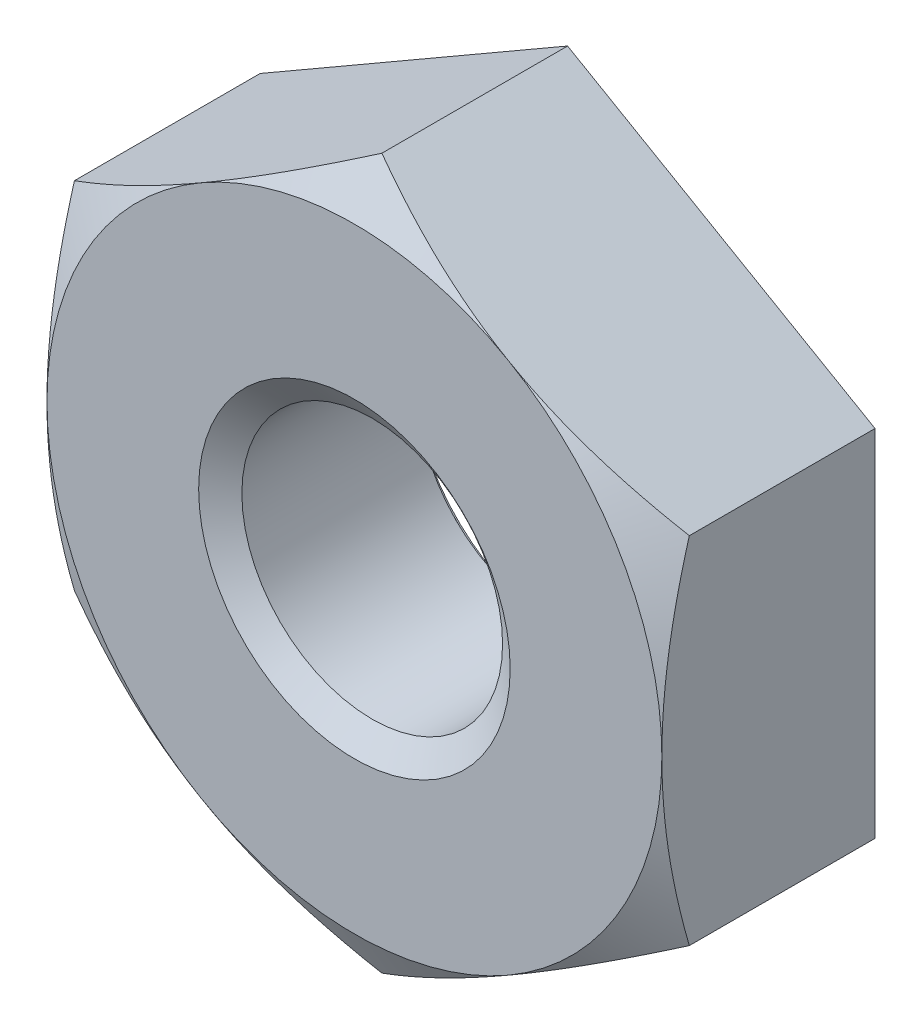
ISO-10303-21;
HEADER;
FILE_DESCRIPTION(('STEP AP214'),'2;1');
FILE_NAME('part.step','',(''),(''),'','','');
FILE_SCHEMA(('AUTOMOTIVE_DESIGN { 1 0 10303 214 1 1 1 1 }'));
ENDSEC;
DATA;
#1=APPLICATION_CONTEXT('core data for automotive mechanical design processes');
#2=APPLICATION_PROTOCOL_DEFINITION('international standard','automotive_design',2000,#1);
#3=PRODUCT_CONTEXT('',#1,'mechanical');
#4=PRODUCT('Part','Part','',(#3));
#5=PRODUCT_RELATED_PRODUCT_CATEGORY('part','',(#4));
#6=PRODUCT_DEFINITION_FORMATION('','',#4);
#7=PRODUCT_DEFINITION_CONTEXT('part definition',#1,'design');
#8=PRODUCT_DEFINITION('design','',#6,#7);
#9=PRODUCT_DEFINITION_SHAPE('','',#8);
#10=(LENGTH_UNIT() NAMED_UNIT(*) SI_UNIT(.MILLI.,.METRE.));
#11=(NAMED_UNIT(*) PLANE_ANGLE_UNIT() SI_UNIT($,.RADIAN.));
#12=(NAMED_UNIT(*) SI_UNIT($,.STERADIAN.) SOLID_ANGLE_UNIT());
#13=UNCERTAINTY_MEASURE_WITH_UNIT(LENGTH_MEASURE(1.E-05),#10,'distance_accuracy_value','');
#14=(GEOMETRIC_REPRESENTATION_CONTEXT(3) GLOBAL_UNCERTAINTY_ASSIGNED_CONTEXT((#13)) GLOBAL_UNIT_ASSIGNED_CONTEXT((#10,
#11,#12)) REPRESENTATION_CONTEXT('',''));
#15=CARTESIAN_POINT('',(0.,0.,0.));
#16=DIRECTION('',(0.,0.,1.));
#17=DIRECTION('',(1.,0.,0.));
#18=AXIS2_PLACEMENT_3D('',#15,#16,#17);
#19=CARTESIAN_POINT('',(0.,0.,-3.302));
#20=DIRECTION('',(0.,0.,1.));
#21=DIRECTION('',(1.,0.,0.));
#22=AXIS2_PLACEMENT_3D('',#19,#20,#21);
#23=CYLINDRICAL_SURFACE('',#22,2.0193);
#24=CARTESIAN_POINT('',(0.,0.,-0.275671707793163));
#25=DIRECTION('',(0.,0.,1.));
#26=DIRECTION('',(1.,0.,0.));
#27=AXIS2_PLACEMENT_3D('',#24,#25,#26);
#28=CIRCLE('',#27,2.0193);
#29=CARTESIAN_POINT('',(2.0193,0.,-0.275671707793163));
#30=VERTEX_POINT('',#29);
#31=EDGE_CURVE('E132',#30,#30,#28,.F.);
#32=CARTESIAN_POINT('',(0.,0.,-3.00092829220683));
#33=DIRECTION('',(0.,0.,-1.));
#34=DIRECTION('',(-1.,0.,0.));
#35=AXIS2_PLACEMENT_3D('',#32,#33,#34);
#36=CIRCLE('',#35,2.0193);
#37=CARTESIAN_POINT('',(2.0193,0.,-3.00092829220683));
#38=VERTEX_POINT('',#37);
#39=EDGE_CURVE('E38',#38,#38,#36,.F.);
#40=CARTESIAN_POINT('',(2.0193,0.,-0.275671707793163));
#41=CARTESIAN_POINT('',(2.0193,0.,-0.304059797214138));
#42=CARTESIAN_POINT('',(2.0193,0.,-0.332447886635114));
#43=CARTESIAN_POINT('',(2.0193,0.,-0.389224065477065));
#44=CARTESIAN_POINT('',(2.0193,0.,-0.417612154898041));
#45=CARTESIAN_POINT('',(2.0193,0.,-0.474388333739993));
#46=CARTESIAN_POINT('',(2.0193,0.,-0.502776423160969));
#47=CARTESIAN_POINT('',(2.0193,0.,-0.55955260200292));
#48=CARTESIAN_POINT('',(2.0193,0.,-0.587940691423896));
#49=CARTESIAN_POINT('',(2.0193,0.,-0.644716870265847));
#50=CARTESIAN_POINT('',(2.0193,0.,-0.673104959686823));
#51=CARTESIAN_POINT('',(2.0193,0.,-0.729881138528774));
#52=CARTESIAN_POINT('',(2.0193,0.,-0.75826922794975));
#53=CARTESIAN_POINT('',(2.0193,0.,-0.815045406791702));
#54=CARTESIAN_POINT('',(2.0193,0.,-0.843433496212678));
#55=CARTESIAN_POINT('',(2.0193,0.,-0.900209675054629));
#56=CARTESIAN_POINT('',(2.0193,0.,-0.928597764475605));
#57=CARTESIAN_POINT('',(2.0193,0.,-0.985373943317556));
#58=CARTESIAN_POINT('',(2.0193,0.,-1.01376203273853));
#59=CARTESIAN_POINT('',(2.0193,0.,-1.07053821158048));
#60=CARTESIAN_POINT('',(2.0193,0.,-1.09892630100146));
#61=CARTESIAN_POINT('',(2.0193,0.,-1.15570247984341));
#62=CARTESIAN_POINT('',(2.0193,0.,-1.18409056926439));
#63=CARTESIAN_POINT('',(2.0193,0.,-1.24086674810634));
#64=CARTESIAN_POINT('',(2.0193,0.,-1.26925483752731));
#65=CARTESIAN_POINT('',(2.0193,0.,-1.32603101636927));
#66=CARTESIAN_POINT('',(2.0193,0.,-1.35441910579024));
#67=CARTESIAN_POINT('',(2.0193,0.,-1.41119528463219));
#68=CARTESIAN_POINT('',(2.0193,0.,-1.43958337405317));
#69=CARTESIAN_POINT('',(2.0193,0.,-1.49635955289512));
#70=CARTESIAN_POINT('',(2.0193,0.,-1.5247476423161));
#71=CARTESIAN_POINT('',(2.0193,0.,-1.58152382115805));
#72=CARTESIAN_POINT('',(2.0193,0.,-1.60991191057902));
#73=CARTESIAN_POINT('',(2.0193,0.,-1.66668808942097));
#74=CARTESIAN_POINT('',(2.0193,0.,-1.69507617884195));
#75=CARTESIAN_POINT('',(2.0193,0.,-1.7518523576839));
#76=CARTESIAN_POINT('',(2.0193,0.,-1.78024044710488));
#77=CARTESIAN_POINT('',(2.0193,0.,-1.83701662594683));
#78=CARTESIAN_POINT('',(2.0193,0.,-1.8654047153678));
#79=CARTESIAN_POINT('',(2.0193,0.,-1.92218089420976));
#80=CARTESIAN_POINT('',(2.0193,0.,-1.95056898363073));
#81=CARTESIAN_POINT('',(2.0193,0.,-2.00734516247268));
#82=CARTESIAN_POINT('',(2.0193,0.,-2.03573325189366));
#83=CARTESIAN_POINT('',(2.0193,0.,-2.09250943073561));
#84=CARTESIAN_POINT('',(2.0193,0.,-2.12089752015659));
#85=CARTESIAN_POINT('',(2.0193,0.,-2.17767369899854));
#86=CARTESIAN_POINT('',(2.0193,0.,-2.20606178841951));
#87=CARTESIAN_POINT('',(2.0193,0.,-2.26283796726147));
#88=CARTESIAN_POINT('',(2.0193,0.,-2.29122605668244));
#89=CARTESIAN_POINT('',(2.0193,0.,-2.34800223552439));
#90=CARTESIAN_POINT('',(2.0193,0.,-2.37639032494537));
#91=CARTESIAN_POINT('',(2.0193,0.,-2.43316650378732));
#92=CARTESIAN_POINT('',(2.0193,0.,-2.4615545932083));
#93=CARTESIAN_POINT('',(2.0193,0.,-2.51833077205025));
#94=CARTESIAN_POINT('',(2.0193,0.,-2.54671886147122));
#95=CARTESIAN_POINT('',(2.0193,0.,-2.60349504031317));
#96=CARTESIAN_POINT('',(2.0193,0.,-2.63188312973415));
#97=CARTESIAN_POINT('',(2.0193,0.,-2.6886593085761));
#98=CARTESIAN_POINT('',(2.0193,0.,-2.71704739799708));
#99=CARTESIAN_POINT('',(2.0193,0.,-2.77382357683903));
#100=CARTESIAN_POINT('',(2.0193,0.,-2.80221166626));
#101=CARTESIAN_POINT('',(2.0193,0.,-2.85898784510196));
#102=CARTESIAN_POINT('',(2.0193,0.,-2.88737593452293));
#103=CARTESIAN_POINT('',(2.0193,0.,-2.94415211336488));
#104=CARTESIAN_POINT('',(2.0193,0.,-2.97254020278586));
#105=CARTESIAN_POINT('',(2.0193,0.,-3.00092829220683));
#106=B_SPLINE_CURVE_WITH_KNOTS('',3,(#40,#41,#42,#43,#44,#45,#46,#47,#48,#49,#50,#51,#52,#53,
#54,#55,#56,#57,#58,#59,#60,#61,#62,#63,#64,#65,#66,#67,#68,#69,#70,#71,#72,#73,#74,#75,#76,#77,
#78,#79,#80,#81,#82,#83,#84,#85,#86,#87,#88,#89,#90,#91,#92,#93,#94,#95,#96,#97,#98,#99,#100,
#101,#102,#103,#104,#105),.UNSPECIFIED.,.F.,.F.,(4,2,2,2,2,2,2,2,2,2,2,2,2,2,2,2,2,2,2,2,2,2,2,
2,2,2,2,2,2,2,2,2,4),(0.,0.0851642682629271,0.170328536525855,0.255492804788782,
0.340657073051709,0.425821341314636,0.510985609577564,0.596149877840491,0.681314146103418,
0.766478414366345,0.851642682629273,0.9368069508922,1.02197121915513,1.10713548741805,
1.19229975568098,1.27746402394391,1.36262829220684,1.44779256046976,1.53295682873269,
1.61812109699562,1.70328536525855,1.78844963352147,1.8736139017844,1.95877817004733,
2.04394243831025,2.12910670657318,2.21427097483611,2.29943524309904,2.38459951136196,
2.46976377962489,2.55492804788782,2.64009231615075,2.72525658441367),.UNSPECIFIED.);
#107=EDGE_CURVE('BSEAM33',#30,#38,#106,.T.);
#108=ORIENTED_EDGE('',*,*,#31,.F.);
#109=ORIENTED_EDGE('',*,*,#39,.F.);
#110=ORIENTED_EDGE('',*,*,#107,.T.);
#111=ORIENTED_EDGE('',*,*,#107,.F.);
#112=EDGE_LOOP('',(#108,#110,#109,#111));
#113=FACE_BOUND('',#112,.T.);
#114=ADVANCED_FACE('F33',(#113),#23,.F.);
#115=CARTESIAN_POINT('',(0.,5.49926131403119,-3.302));
#116=DIRECTION('',(-0.500000000000002,0.866025403784437,0.));
#117=DIRECTION('',(-0.866025403784438,-0.500000000000002,0.));
#118=AXIS2_PLACEMENT_3D('',#115,#116,#117);
#119=PLANE('',#118);
#120=DIRECTION('',(0.,0.,1.));
#121=VECTOR('',#120,1.);
#122=CARTESIAN_POINT('',(-4.7625,2.74963065701559,-3.302));
#123=LINE('',#122,#121);
#124=CARTESIAN_POINT('',(-4.7625,2.74963065701559,-3.302));
#125=VERTEX_POINT('',#124);
#126=CARTESIAN_POINT('',(-4.7625,2.74963065701559,-0.425369342984413));
#127=VERTEX_POINT('',#126);
#128=EDGE_CURVE('E238',#125,#127,#123,.T.);
#129=ORIENTED_EDGE('',*,*,#128,.T.);
#130=CARTESIAN_POINT('',(-4.7627,2.74951518696175,-0.425436011750766));
#131=CARTESIAN_POINT('',(-4.55340263838612,2.8703530750302,-0.355653612413944));
#132=CARTESIAN_POINT('',(-4.34231515161877,2.99222449233789,-0.292183264615223));
#133=CARTESIAN_POINT('',(-3.91648500907589,3.23807763976408,-0.181395196068723));
#134=CARTESIAN_POINT('',(-3.701734787416,3.36206373804795,-0.134116665429795));
#135=CARTESIAN_POINT('',(-3.27486304406647,3.60851825398025,-0.0605335253687842));
#136=CARTESIAN_POINT('',(-3.06280800150459,3.73094828988637,-0.0337387922017265));
#137=CARTESIAN_POINT('',(-2.7439794939507,3.91502401454793,-0.00971112218087642));
#138=CARTESIAN_POINT('',(-2.63763059112772,3.9764245822208,-0.00439464100931322));
#139=CARTESIAN_POINT('',(-2.42483449751003,4.09928246415348,0.000759836568294737));
#140=CARTESIAN_POINT('',(-2.31838730985274,4.16073977660189,0.000598002190793362));
#141=CARTESIAN_POINT('',(-2.02675051194544,4.32911636037927,-0.00738494982191031));
#142=CARTESIAN_POINT('',(-1.84165753319303,4.43597984148709,-0.0207924204878943));
#143=CARTESIAN_POINT('',(-1.47270002105863,4.64899756043742,-0.0633078628436929));
#144=CARTESIAN_POINT('',(-1.28883678458933,4.75515104950705,-0.0924303682801025));
#145=CARTESIAN_POINT('',(-0.919135889202235,4.96859796097843,-0.165229253586903));
#146=CARTESIAN_POINT('',(-0.733344890273215,5.07586444422311,-0.209214113046657));
#147=CARTESIAN_POINT('',(-0.364533730991681,5.28879766631445,-0.30904227993883));
#148=CARTESIAN_POINT('',(-0.181508846544095,5.39446713261866,-0.364862134678061));
#149=CARTESIAN_POINT('',(0.000199999999996819,5.49937678408503,-0.425436011750772));
#150=B_SPLINE_CURVE_WITH_KNOTS('',3,(#130,#131,#132,#133,#134,#135,#136,#137,#138,#139,#140,
#141,#142,#143,#144,#145,#146,#147,#148,#149),.UNSPECIFIED.,.F.,.F.,(4,2,2,2,2,2,2,2,2,4),(0.,
0.754910190012917,1.51163483480638,2.24963134670895,2.61827336240839,2.9869039913527,
3.6286742319225,4.27103902109237,4.92765153591997,5.58297484368455),.UNSPECIFIED.);
#151=CARTESIAN_POINT('',(-2.38125000000001,4.12444598552338,0.));
#152=VERTEX_POINT('',#151);
#153=EDGE_CURVE('E57',#127,#152,#150,.T.);
#154=ORIENTED_EDGE('',*,*,#153,.T.);
#155=CARTESIAN_POINT('',(0.,5.49926131403119,-0.425369342984412));
#156=VERTEX_POINT('',#155);
#157=EDGE_CURVE('E145',#152,#156,#150,.T.);
#158=ORIENTED_EDGE('',*,*,#157,.T.);
#159=DIRECTION('',(0.,0.,1.));
#160=VECTOR('',#159,1.);
#161=CARTESIAN_POINT('',(0.,5.49926131403119,-3.302));
#162=LINE('',#161,#160);
#163=CARTESIAN_POINT('',(0.,5.49926131403119,-3.302));
#164=VERTEX_POINT('',#163);
#165=EDGE_CURVE('E237',#164,#156,#162,.T.);
#166=ORIENTED_EDGE('',*,*,#165,.F.);
#167=DIRECTION('',(-0.866025403784437,-0.500000000000002,0.));
#168=VECTOR('',#167,1.);
#169=CARTESIAN_POINT('',(0.,5.49926131403119,-3.302));
#170=LINE('',#169,#168);
#171=EDGE_CURVE('E265',#164,#125,#170,.T.);
#172=ORIENTED_EDGE('',*,*,#171,.T.);
#173=EDGE_LOOP('',(#129,#154,#158,#166,#172));
#174=FACE_BOUND('',#173,.T.);
#175=ADVANCED_FACE('F35',(#174),#119,.T.);
#176=CARTESIAN_POINT('',(4.7625,2.74963065701559,-3.302));
#177=DIRECTION('',(0.500000000000001,0.866025403784438,0.));
#178=DIRECTION('',(-0.866025403784438,0.500000000000001,0.));
#179=AXIS2_PLACEMENT_3D('',#176,#177,#178);
#180=PLANE('',#179);
#181=ORIENTED_EDGE('',*,*,#165,.T.);
#182=CARTESIAN_POINT('',(-0.000200000000002983,5.49937678408503,-0.425436011750773));
#183=CARTESIAN_POINT('',(0.209097361613876,5.37853889601658,-0.35565361241395));
#184=CARTESIAN_POINT('',(0.420184848381226,5.25666747870889,-0.292183264615228));
#185=CARTESIAN_POINT('',(0.846014990924112,5.01081433128269,-0.181395196068727));
#186=CARTESIAN_POINT('',(1.060765212584,4.88682823299883,-0.134116665429799));
#187=CARTESIAN_POINT('',(1.48763695593353,4.64037371706653,-0.060533525368787));
#188=CARTESIAN_POINT('',(1.69969199849541,4.51794368116041,-0.0337387922017288));
#189=CARTESIAN_POINT('',(2.0185205060493,4.33386795649885,-0.00971112218087808));
#190=CARTESIAN_POINT('',(2.12486940887228,4.27246738882597,-0.00439464100931467));
#191=CARTESIAN_POINT('',(2.33766550248998,4.1496095068933,0.000759836568293921));
#192=CARTESIAN_POINT('',(2.44411269014726,4.08815219444488,0.000598002190792994));
#193=CARTESIAN_POINT('',(2.73574948805456,3.9197756106675,-0.00738494982190966));
#194=CARTESIAN_POINT('',(2.92084246680697,3.81291212955969,-0.0207924204878932));
#195=CARTESIAN_POINT('',(3.28979997894137,3.59989441060936,-0.0633078628436906));
#196=CARTESIAN_POINT('',(3.47366321541067,3.49374092153973,-0.0924303682800995));
#197=CARTESIAN_POINT('',(3.84336411079777,3.28029401006835,-0.165229253586899));
#198=CARTESIAN_POINT('',(4.02915510972679,3.17302752682367,-0.209214113046653));
#199=CARTESIAN_POINT('',(4.39796626900832,2.96009430473233,-0.309042279938826));
#200=CARTESIAN_POINT('',(4.58099115345591,2.85442483842812,-0.364862134678056));
#201=CARTESIAN_POINT('',(4.7627,2.74951518696175,-0.425436011750767));
#202=B_SPLINE_CURVE_WITH_KNOTS('',3,(#182,#183,#184,#185,#186,#187,#188,#189,#190,#191,#192,
#193,#194,#195,#196,#197,#198,#199,#200,#201),.UNSPECIFIED.,.F.,.F.,(4,2,2,2,2,2,2,2,2,4),(0.,
0.754910190012919,1.51163483480638,2.24963134670895,2.6182733624084,2.9869039913527,
3.6286742319225,4.27103902109237,4.92765153591997,5.58297484368456),.UNSPECIFIED.);
#203=CARTESIAN_POINT('',(2.38125000000001,4.12444598552339,0.));
#204=VERTEX_POINT('',#203);
#205=EDGE_CURVE('E142',#156,#204,#202,.T.);
#206=ORIENTED_EDGE('',*,*,#205,.T.);
#207=CARTESIAN_POINT('',(4.7625,2.74963065701561,-0.425369342984412));
#208=VERTEX_POINT('',#207);
#209=EDGE_CURVE('E126',#204,#208,#202,.T.);
#210=ORIENTED_EDGE('',*,*,#209,.T.);
#211=DIRECTION('',(0.,0.,1.));
#212=VECTOR('',#211,1.);
#213=CARTESIAN_POINT('',(4.7625,2.74963065701559,-3.302));
#214=LINE('',#213,#212);
#215=CARTESIAN_POINT('',(4.7625,2.74963065701559,-3.302));
#216=VERTEX_POINT('',#215);
#217=EDGE_CURVE('E141',#216,#208,#214,.T.);
#218=ORIENTED_EDGE('',*,*,#217,.F.);
#219=DIRECTION('',(-0.866025403784438,0.500000000000001,0.));
#220=VECTOR('',#219,1.);
#221=CARTESIAN_POINT('',(4.7625,2.74963065701559,-3.302));
#222=LINE('',#221,#220);
#223=EDGE_CURVE('E242',#216,#164,#222,.T.);
#224=ORIENTED_EDGE('',*,*,#223,.T.);
#225=EDGE_LOOP('',(#181,#206,#210,#218,#224));
#226=FACE_BOUND('',#225,.T.);
#227=ADVANCED_FACE('F217',(#226),#180,.T.);
#228=CARTESIAN_POINT('',(4.7625,2.74963065701559,-3.302));
#229=DIRECTION('',(-1.,0.,0.));
#230=DIRECTION('',(0.,0.,1.));
#231=AXIS2_PLACEMENT_3D('',#228,#229,#230);
#232=PLANE('',#231);
#233=CARTESIAN_POINT('',(4.7625,-7.29242571304484,-2.27898343403964));
#234=CARTESIAN_POINT('',(4.7625,-7.08332503258644,-2.17793443460892));
#235=CARTESIAN_POINT('',(4.7625,-6.87372996761939,-2.07788994627172));
#236=CARTESIAN_POINT('',(4.7625,-6.45328375890255,-1.88038400304187));
#237=CARTESIAN_POINT('',(4.7625,-6.24243240531598,-1.78292299537275));
#238=CARTESIAN_POINT('',(4.7625,-5.818067307616,-1.59064459480452));
#239=CARTESIAN_POINT('',(4.7625,-5.60454523269944,-1.49584552190854));
#240=CARTESIAN_POINT('',(4.7625,-5.17574610716182,-1.31031922922938));
#241=CARTESIAN_POINT('',(4.7625,-4.96046914871243,-1.21959179719919));
#242=CARTESIAN_POINT('',(4.7625,-4.52514542755381,-1.04221436450315));
#243=CARTESIAN_POINT('',(4.7625,-4.30507255346547,-0.95562809667714));
#244=CARTESIAN_POINT('',(4.7625,-3.86233085885286,-0.789237026079924));
#245=CARTESIAN_POINT('',(4.7625,-3.6396617526365,-0.709432977795153));
#246=CARTESIAN_POINT('',(4.7625,-3.19183146915337,-0.558750437330524));
#247=CARTESIAN_POINT('',(4.7625,-2.96667674136296,-0.48785296946411));
#248=CARTESIAN_POINT('',(4.7625,-2.51316408606384,-0.357286935151367));
#249=CARTESIAN_POINT('',(4.7625,-2.28480719615869,-0.297614817726105));
#250=CARTESIAN_POINT('',(4.7625,-1.82474524250016,-0.192393335725107));
#251=CARTESIAN_POINT('',(4.7625,-1.59303930440612,-0.146847731515044));
#252=CARTESIAN_POINT('',(4.7625,-1.12680140245446,-0.0729572667243248));
#253=CARTESIAN_POINT('',(4.7625,-0.892269436098455,-0.044612421351301));
#254=CARTESIAN_POINT('',(4.7625,-0.540098243423067,-0.0168127698224282));
#255=CARTESIAN_POINT('',(4.7625,-0.423010288487483,-0.00999774479560475));
#256=CARTESIAN_POINT('',(4.7625,-0.188645495023612,-0.00132916739532877));
#257=CARTESIAN_POINT('',(4.7625,-0.0713686589680046,0.000524449409053692));
#258=CARTESIAN_POINT('',(4.7625,0.163123105354882,-0.000779595326748415));
#259=CARTESIAN_POINT('',(4.7625,0.28033804175227,-0.00393584200216169));
#260=CARTESIAN_POINT('',(4.7625,0.514533140154528,-0.0151795737408415));
#261=CARTESIAN_POINT('',(4.7625,0.631513289308019,-0.0232673217280245));
#262=CARTESIAN_POINT('',(4.7625,0.915050030184746,-0.0486788919016474));
#263=CARTESIAN_POINT('',(4.7625,1.08138937418057,-0.0684745311551024));
#264=CARTESIAN_POINT('',(4.7625,1.41276151801411,-0.116933997609659));
#265=CARTESIAN_POINT('',(4.7625,1.57779414061616,-0.145599007360521));
#266=CARTESIAN_POINT('',(4.7625,2.07083902042288,-0.243383100627564));
#267=CARTESIAN_POINT('',(4.7625,2.39654516294854,-0.324265654459843));
#268=CARTESIAN_POINT('',(4.7625,2.8839114252215,-0.463767781303889));
#269=CARTESIAN_POINT('',(4.7625,3.04811363656014,-0.514009375908404));
#270=CARTESIAN_POINT('',(4.7625,3.37480455011007,-0.619463864370049));
#271=CARTESIAN_POINT('',(4.7625,3.53729434901435,-0.674673329356529));
#272=CARTESIAN_POINT('',(4.7625,3.85988055284393,-0.788914900372853));
#273=CARTESIAN_POINT('',(4.7625,4.01998528140537,-0.847923740867383));
#274=CARTESIAN_POINT('',(4.7625,4.33895253974559,-0.969404920092007));
#275=CARTESIAN_POINT('',(4.7625,4.4978145374447,-1.03187865865025));
#276=CARTESIAN_POINT('',(4.7625,4.6561021660602,-1.09574291091382));
#277=B_SPLINE_CURVE_WITH_KNOTS('',3,(#233,#234,#235,#236,#237,#238,#239,#240,#241,#242,#243,
#244,#245,#246,#247,#248,#249,#250,#251,#252,#253,#254,#255,#256,#257,#258,#259,#260,#261,#262,
#263,#264,#265,#266,#267,#268,#269,#270,#271,#272,#273,#274,#275,#276),.UNSPECIFIED.,.F.,.F.,(4,
2,2,2,2,2,2,2,2,2,2,2,2,2,2,2,2,2,2,2,2,4),(0.,0.696720165483735,1.39356016205725,
2.09438789250382,2.79517904757872,3.50457374312629,4.21404725210227,4.92198260780581,
5.6296936403172,6.33759289852653,7.04549278260686,7.39726182154395,7.74902629223847,
8.10069143675107,8.45237533199633,8.95462912158064,9.45694990534677,10.4623513294482,
10.9774608355396,11.4922174961111,12.0040767603637,12.5161443452105),.UNSPECIFIED.);
#278=CARTESIAN_POINT('',(4.76250000000001,-2.7496306570156,-0.425369342984412));
#279=VERTEX_POINT('',#278);
#280=CARTESIAN_POINT('',(4.7625,0.,0.));
#281=VERTEX_POINT('',#280);
#282=EDGE_CURVE('E107',#279,#281,#277,.T.);
#283=ORIENTED_EDGE('',*,*,#282,.F.);
#284=DIRECTION('',(0.,0.,1.));
#285=VECTOR('',#284,1.);
#286=CARTESIAN_POINT('',(4.7625,-2.7496306570156,-3.302));
#287=LINE('',#286,#285);
#288=CARTESIAN_POINT('',(4.7625,-2.7496306570156,-3.302));
#289=VERTEX_POINT('',#288);
#290=EDGE_CURVE('E247',#289,#279,#287,.T.);
#291=ORIENTED_EDGE('',*,*,#290,.F.);
#292=DIRECTION('',(0.,-1.,0.));
#293=VECTOR('',#292,1.);
#294=CARTESIAN_POINT('',(4.7625,2.74963065701559,-3.302));
#295=LINE('',#294,#293);
#296=EDGE_CURVE('E254',#216,#289,#295,.T.);
#297=ORIENTED_EDGE('',*,*,#296,.F.);
#298=ORIENTED_EDGE('',*,*,#217,.T.);
#299=EDGE_CURVE('E120',#281,#208,#277,.T.);
#300=ORIENTED_EDGE('',*,*,#299,.F.);
#301=EDGE_LOOP('',(#283,#291,#297,#298,#300));
#302=FACE_BOUND('',#301,.T.);
#303=ADVANCED_FACE('F139',(#302),#232,.F.);
#304=CARTESIAN_POINT('',(0.,-5.49926131403121,-3.302));
#305=DIRECTION('',(0.500000000000002,-0.866025403784438,0.));
#306=DIRECTION('',(0.866025403784438,0.500000000000002,0.));
#307=AXIS2_PLACEMENT_3D('',#304,#305,#306);
#308=PLANE('',#307);
#309=ORIENTED_EDGE('',*,*,#290,.T.);
#310=CARTESIAN_POINT('',(4.7627,-2.74951518696176,-0.42543601175077));
#311=CARTESIAN_POINT('',(4.55340263838612,-2.87035307503021,-0.355653612413947));
#312=CARTESIAN_POINT('',(4.34231515161877,-2.99222449233791,-0.292183264615227));
#313=CARTESIAN_POINT('',(3.91648500907588,-3.2380776397641,-0.181395196068727));
#314=CARTESIAN_POINT('',(3.70173478741599,-3.36206373804797,-0.1341166654298));
#315=CARTESIAN_POINT('',(3.27486304406647,-3.60851825398026,-0.0605335253687901));
#316=CARTESIAN_POINT('',(3.06280800150458,-3.73094828988639,-0.0337387922017326));
#317=CARTESIAN_POINT('',(2.7439794939507,-3.91502401454795,-0.00971112218088317));
#318=CARTESIAN_POINT('',(2.63763059112771,-3.97642458222082,-0.00439464100932027));
#319=CARTESIAN_POINT('',(2.42483449751002,-4.0992824641535,0.000759836568287514));
#320=CARTESIAN_POINT('',(2.31838730985274,-4.16073977660191,0.000598002190786272));
#321=CARTESIAN_POINT('',(2.02675051194544,-4.32911636037929,-0.00738494982191751));
#322=CARTESIAN_POINT('',(1.84165753319303,-4.4359798414871,-0.020792420487902));
#323=CARTESIAN_POINT('',(1.47270002105863,-4.64899756043744,-0.063307862843701));
#324=CARTESIAN_POINT('',(1.28883678458933,-4.75515104950706,-0.0924303682801104));
#325=CARTESIAN_POINT('',(0.919135889202231,-4.96859796097845,-0.16522925358691));
#326=CARTESIAN_POINT('',(0.733344890273212,-5.07586444422313,-0.209214113046665));
#327=CARTESIAN_POINT('',(0.364533730991678,-5.28879766631446,-0.309042279938839));
#328=CARTESIAN_POINT('',(0.181508846544091,-5.39446713261868,-0.364862134678069));
#329=CARTESIAN_POINT('',(-0.000199999999999972,-5.49937678408504,-0.42543601175078));
#330=B_SPLINE_CURVE_WITH_KNOTS('',3,(#310,#311,#312,#313,#314,#315,#316,#317,#318,#319,#320,
#321,#322,#323,#324,#325,#326,#327,#328,#329),.UNSPECIFIED.,.F.,.F.,(4,2,2,2,2,2,2,2,2,4),(0.,
0.754910190012917,1.51163483480638,2.24963134670895,2.61827336240839,2.9869039913527,
3.6286742319225,4.27103902109237,4.92765153591997,5.58297484368455),.UNSPECIFIED.);
#331=CARTESIAN_POINT('',(2.38125000000001,-4.12444598552339,0.));
#332=VERTEX_POINT('',#331);
#333=EDGE_CURVE('E114',#279,#332,#330,.T.);
#334=ORIENTED_EDGE('',*,*,#333,.T.);
#335=CARTESIAN_POINT('',(0.,-5.49926131403119,-0.425369342984412));
#336=VERTEX_POINT('',#335);
#337=EDGE_CURVE('E153',#332,#336,#330,.T.);
#338=ORIENTED_EDGE('',*,*,#337,.T.);
#339=DIRECTION('',(0.,0.,1.));
#340=VECTOR('',#339,1.);
#341=CARTESIAN_POINT('',(0.,-5.49926131403121,-3.302));
#342=LINE('',#341,#340);
#343=CARTESIAN_POINT('',(0.,-5.49926131403121,-3.302));
#344=VERTEX_POINT('',#343);
#345=EDGE_CURVE('E244',#344,#336,#342,.T.);
#346=ORIENTED_EDGE('',*,*,#345,.F.);
#347=DIRECTION('',(0.866025403784438,0.500000000000002,0.));
#348=VECTOR('',#347,1.);
#349=CARTESIAN_POINT('',(0.,-5.49926131403121,-3.302));
#350=LINE('',#349,#348);
#351=EDGE_CURVE('E256',#344,#289,#350,.T.);
#352=ORIENTED_EDGE('',*,*,#351,.T.);
#353=EDGE_LOOP('',(#309,#334,#338,#346,#352));
#354=FACE_BOUND('',#353,.T.);
#355=ADVANCED_FACE('F199',(#354),#308,.T.);
#356=CARTESIAN_POINT('',(-4.7625,-2.7496306570156,-3.302));
#357=DIRECTION('',(-0.500000000000001,-0.866025403784438,0.));
#358=DIRECTION('',(0.866025403784438,-0.500000000000001,0.));
#359=AXIS2_PLACEMENT_3D('',#356,#357,#358);
#360=PLANE('',#359);
#361=ORIENTED_EDGE('',*,*,#345,.T.);
#362=CARTESIAN_POINT('',(0.00020000000000037,-5.49937678408504,-0.42543601175078));
#363=CARTESIAN_POINT('',(-0.209097361613879,-5.37853889601659,-0.355653612413957));
#364=CARTESIAN_POINT('',(-0.42018484838123,-5.2566674787089,-0.292183264615236));
#365=CARTESIAN_POINT('',(-0.846014990924117,-5.01081433128271,-0.181395196068734));
#366=CARTESIAN_POINT('',(-1.06076521258401,-4.88682823299884,-0.134116665429806));
#367=CARTESIAN_POINT('',(-1.48763695593353,-4.64037371706654,-0.0605335253687945));
#368=CARTESIAN_POINT('',(-1.69969199849542,-4.51794368116042,-0.0337387922017366));
#369=CARTESIAN_POINT('',(-2.01852050604931,-4.33386795649886,-0.00971112218088568));
#370=CARTESIAN_POINT('',(-2.12486940887229,-4.27246738882598,-0.00439464100932212));
#371=CARTESIAN_POINT('',(-2.33766550248999,-4.14960950689331,0.000759836568286355));
#372=CARTESIAN_POINT('',(-2.44411269014727,-4.08815219444489,0.000598002190785165));
#373=CARTESIAN_POINT('',(-2.73574948805457,-3.91977561066752,-0.00738494982191796));
#374=CARTESIAN_POINT('',(-2.92084246680698,-3.8129121295597,-0.0207924204879014));
#375=CARTESIAN_POINT('',(-3.28979997894138,-3.59989441060937,-0.0633078628436988));
#376=CARTESIAN_POINT('',(-3.47366321541067,-3.49374092153975,-0.0924303682801078));
#377=CARTESIAN_POINT('',(-3.84336411079777,-3.28029401006836,-0.165229253586906));
#378=CARTESIAN_POINT('',(-4.02915510972679,-3.17302752682368,-0.20921411304666));
#379=CARTESIAN_POINT('',(-4.39796626900832,-2.96009430473235,-0.309042279938832));
#380=CARTESIAN_POINT('',(-4.58099115345591,-2.85442483842813,-0.364862134678061));
#381=CARTESIAN_POINT('',(-4.7627,-2.74951518696177,-0.425436011750772));
#382=B_SPLINE_CURVE_WITH_KNOTS('',3,(#362,#363,#364,#365,#366,#367,#368,#369,#370,#371,#372,
#373,#374,#375,#376,#377,#378,#379,#380,#381),.UNSPECIFIED.,.F.,.F.,(4,2,2,2,2,2,2,2,2,4),(0.,
0.754910190012921,1.51163483480639,2.24963134670896,2.6182733624084,2.98690399135271,
3.62867423192251,4.27103902109237,4.92765153591997,5.58297484368455),.UNSPECIFIED.);
#383=CARTESIAN_POINT('',(-2.38125000000001,-4.12444598552339,0.));
#384=VERTEX_POINT('',#383);
#385=EDGE_CURVE('E193',#336,#384,#382,.T.);
#386=ORIENTED_EDGE('',*,*,#385,.T.);
#387=CARTESIAN_POINT('',(-4.7625,-2.7496306570156,-0.425369342984412));
#388=VERTEX_POINT('',#387);
#389=EDGE_CURVE('E185',#384,#388,#382,.T.);
#390=ORIENTED_EDGE('',*,*,#389,.T.);
#391=DIRECTION('',(0.,0.,1.));
#392=VECTOR('',#391,1.);
#393=CARTESIAN_POINT('',(-4.7625,-2.7496306570156,-3.302));
#394=LINE('',#393,#392);
#395=CARTESIAN_POINT('',(-4.7625,-2.7496306570156,-3.302));
#396=VERTEX_POINT('',#395);
#397=EDGE_CURVE('E241',#396,#388,#394,.T.);
#398=ORIENTED_EDGE('',*,*,#397,.F.);
#399=DIRECTION('',(0.866025403784438,-0.500000000000001,0.));
#400=VECTOR('',#399,1.);
#401=CARTESIAN_POINT('',(-4.7625,-2.7496306570156,-3.302));
#402=LINE('',#401,#400);
#403=EDGE_CURVE('E259',#396,#344,#402,.T.);
#404=ORIENTED_EDGE('',*,*,#403,.T.);
#405=EDGE_LOOP('',(#361,#386,#390,#398,#404));
#406=FACE_BOUND('',#405,.T.);
#407=ADVANCED_FACE('F195',(#406),#360,.T.);
#408=CARTESIAN_POINT('',(-4.7625,2.74963065701559,-3.302));
#409=DIRECTION('',(-1.,0.,0.));
#410=DIRECTION('',(0.,0.,1.));
#411=AXIS2_PLACEMENT_3D('',#408,#409,#410);
#412=PLANE('',#411);
#413=ORIENTED_EDGE('',*,*,#397,.T.);
#414=CARTESIAN_POINT('',(-4.7625,-7.29242571304485,-2.27898343403965));
#415=CARTESIAN_POINT('',(-4.7625,-7.08332503258645,-2.17793443460893));
#416=CARTESIAN_POINT('',(-4.7625,-6.8737299676194,-2.07788994627172));
#417=CARTESIAN_POINT('',(-4.7625,-6.45328375890255,-1.88038400304188));
#418=CARTESIAN_POINT('',(-4.7625,-6.24243240531599,-1.78292299537276));
#419=CARTESIAN_POINT('',(-4.7625,-5.81806730761601,-1.59064459480452));
#420=CARTESIAN_POINT('',(-4.7625,-5.60454523269944,-1.49584552190855));
#421=CARTESIAN_POINT('',(-4.7625,-5.17574610716182,-1.31031922922938));
#422=CARTESIAN_POINT('',(-4.7625,-4.96046914871244,-1.21959179719919));
#423=CARTESIAN_POINT('',(-4.7625,-4.52514542755381,-1.04221436450316));
#424=CARTESIAN_POINT('',(-4.7625,-4.30507255346547,-0.955628096677142));
#425=CARTESIAN_POINT('',(-4.7625,-3.86233085885287,-0.789237026079925));
#426=CARTESIAN_POINT('',(-4.7625,-3.63966175263651,-0.709432977795155));
#427=CARTESIAN_POINT('',(-4.7625,-3.19183146915337,-0.558750437330527));
#428=CARTESIAN_POINT('',(-4.7625,-2.96667674136296,-0.487852969464112));
#429=CARTESIAN_POINT('',(-4.7625,-2.51316408606384,-0.357286935151368));
#430=CARTESIAN_POINT('',(-4.7625,-2.28480719615869,-0.297614817726107));
#431=CARTESIAN_POINT('',(-4.7625,-1.82474524250016,-0.192393335725108));
#432=CARTESIAN_POINT('',(-4.7625,-1.59303930440613,-0.146847731515046));
#433=CARTESIAN_POINT('',(-4.7625,-1.12680140245446,-0.0729572667243261));
#434=CARTESIAN_POINT('',(-4.7625,-0.892269436098457,-0.0446124213513021));
#435=CARTESIAN_POINT('',(-4.7625,-0.540098243423068,-0.0168127698224292));
#436=CARTESIAN_POINT('',(-4.7625,-0.423010288487485,-0.00999774479560574));
#437=CARTESIAN_POINT('',(-4.7625,-0.188645495023614,-0.00132916739532978));
#438=CARTESIAN_POINT('',(-4.7625,-0.0713686589680062,0.000524449409052686));
#439=CARTESIAN_POINT('',(-4.7625,0.163123105354881,-0.000779595326749411));
#440=CARTESIAN_POINT('',(-4.7625,0.280338041752268,-0.00393584200216268));
#441=CARTESIAN_POINT('',(-4.7625,0.514533140154526,-0.0151795737408425));
#442=CARTESIAN_POINT('',(-4.7625,0.631513289308017,-0.0232673217280256));
#443=CARTESIAN_POINT('',(-4.7625,0.915050030184744,-0.0486788919016483));
#444=CARTESIAN_POINT('',(-4.7625,1.08138937418056,-0.068474531155103));
#445=CARTESIAN_POINT('',(-4.7625,1.41276151801411,-0.116933997609659));
#446=CARTESIAN_POINT('',(-4.7625,1.57779414061616,-0.145599007360522));
#447=CARTESIAN_POINT('',(-4.7625,2.07083902042288,-0.243383100627565));
#448=CARTESIAN_POINT('',(-4.7625,2.39654516294853,-0.324265654459844));
#449=CARTESIAN_POINT('',(-4.7625,2.8839114252215,-0.46376778130389));
#450=CARTESIAN_POINT('',(-4.7625,3.04811363656014,-0.514009375908405));
#451=CARTESIAN_POINT('',(-4.7625,3.37480455011007,-0.61946386437005));
#452=CARTESIAN_POINT('',(-4.7625,3.53729434901435,-0.674673329356529));
#453=CARTESIAN_POINT('',(-4.7625,3.85988055284393,-0.788914900372853));
#454=CARTESIAN_POINT('',(-4.7625,4.01998528140537,-0.847923740867384));
#455=CARTESIAN_POINT('',(-4.7625,4.33895253974559,-0.969404920092007));
#456=CARTESIAN_POINT('',(-4.7625,4.4978145374447,-1.03187865865025));
#457=CARTESIAN_POINT('',(-4.7625,4.65610216606019,-1.09574291091382));
#458=B_SPLINE_CURVE_WITH_KNOTS('',3,(#414,#415,#416,#417,#418,#419,#420,#421,#422,#423,#424,
#425,#426,#427,#428,#429,#430,#431,#432,#433,#434,#435,#436,#437,#438,#439,#440,#441,#442,#443,
#444,#445,#446,#447,#448,#449,#450,#451,#452,#453,#454,#455,#456,#457),.UNSPECIFIED.,.F.,.F.,(4,
2,2,2,2,2,2,2,2,2,2,2,2,2,2,2,2,2,2,2,2,4),(0.,0.696720165483736,1.39356016205726,
2.09438789250382,2.79517904757873,3.50457374312629,4.21404725210227,4.92198260780581,
5.62969364031721,6.33759289852654,7.04549278260687,7.39726182154396,7.74902629223848,
8.10069143675108,8.45237533199634,8.95462912158065,9.45694990534678,10.4623513294482,
10.9774608355396,11.4922174961111,12.0040767603637,12.5161443452105),.UNSPECIFIED.);
#459=CARTESIAN_POINT('',(-4.7625,0.,0.));
#460=VERTEX_POINT('',#459);
#461=EDGE_CURVE('E194',#388,#460,#458,.T.);
#462=ORIENTED_EDGE('',*,*,#461,.T.);
#463=EDGE_CURVE('E131',#460,#127,#458,.T.);
#464=ORIENTED_EDGE('',*,*,#463,.T.);
#465=ORIENTED_EDGE('',*,*,#128,.F.);
#466=DIRECTION('',(0.,-1.,0.));
#467=VECTOR('',#466,1.);
#468=CARTESIAN_POINT('',(-4.7625,2.74963065701559,-3.302));
#469=LINE('',#468,#467);
#470=EDGE_CURVE('E262',#125,#396,#469,.T.);
#471=ORIENTED_EDGE('',*,*,#470,.T.);
#472=EDGE_LOOP('',(#413,#462,#464,#465,#471));
#473=FACE_BOUND('',#472,.T.);
#474=ADVANCED_FACE('F198',(#473),#412,.T.);
#475=CARTESIAN_POINT('',(0.,5.49926131403119,0.));
#476=DIRECTION('',(0.,0.,-1.));
#477=DIRECTION('',(-1.,0.,0.));
#478=AXIS2_PLACEMENT_3D('',#475,#476,#477);
#479=PLANE('',#478);
#480=CARTESIAN_POINT('',(0.,0.,0.));
#481=DIRECTION('',(0.,0.,1.));
#482=DIRECTION('',(1.,0.,0.));
#483=AXIS2_PLACEMENT_3D('',#480,#481,#482);
#484=CIRCLE('',#483,2.413);
#485=CARTESIAN_POINT('',(2.413,0.,0.));
#486=VERTEX_POINT('',#485);
#487=EDGE_CURVE('E225',#486,#486,#484,.T.);
#488=ORIENTED_EDGE('',*,*,#487,.F.);
#489=EDGE_LOOP('',(#488));
#490=FACE_BOUND('',#489,.T.);
#491=CARTESIAN_POINT('',(0.,0.,0.));
#492=DIRECTION('',(0.,0.,-1.));
#493=DIRECTION('',(-1.,0.,0.));
#494=AXIS2_PLACEMENT_3D('',#491,#492,#493);
#495=CIRCLE('',#494,4.7625);
#496=EDGE_CURVE('E45',#152,#460,#495,.F.);
#497=ORIENTED_EDGE('',*,*,#496,.T.);
#498=EDGE_CURVE('E11',#460,#384,#495,.F.);
#499=ORIENTED_EDGE('',*,*,#498,.T.);
#500=EDGE_CURVE('E43',#384,#332,#495,.F.);
#501=ORIENTED_EDGE('',*,*,#500,.T.);
#502=EDGE_CURVE('E111',#332,#281,#495,.F.);
#503=ORIENTED_EDGE('',*,*,#502,.T.);
#504=CARTESIAN_POINT('',(0.,0.,0.));
#505=DIRECTION('',(0.,0.,1.));
#506=DIRECTION('',(1.,0.,0.));
#507=AXIS2_PLACEMENT_3D('',#504,#505,#506);
#508=CIRCLE('',#507,4.7625);
#509=EDGE_CURVE('E123',#281,#204,#508,.T.);
#510=ORIENTED_EDGE('',*,*,#509,.T.);
#511=EDGE_CURVE('E137',#204,#152,#495,.F.);
#512=ORIENTED_EDGE('',*,*,#511,.T.);
#513=EDGE_LOOP('',(#497,#499,#501,#503,#510,#512));
#514=FACE_BOUND('',#513,.T.);
#515=ADVANCED_FACE('F135',(#490,#514),#479,.F.);
#516=CARTESIAN_POINT('',(0.,5.49926131403119,-3.302));
#517=DIRECTION('',(0.,0.,-1.));
#518=DIRECTION('',(-1.,0.,0.));
#519=AXIS2_PLACEMENT_3D('',#516,#517,#518);
#520=PLANE('',#519);
#521=CARTESIAN_POINT('',(0.,0.,-3.302));
#522=DIRECTION('',(0.,0.,-1.));
#523=DIRECTION('',(-1.,0.,0.));
#524=AXIS2_PLACEMENT_3D('',#521,#522,#523);
#525=CIRCLE('',#524,2.413);
#526=CARTESIAN_POINT('',(-2.413,0.,-3.302));
#527=VERTEX_POINT('',#526);
#528=EDGE_CURVE('E226',#527,#527,#525,.F.);
#529=ORIENTED_EDGE('',*,*,#528,.T.);
#530=EDGE_LOOP('',(#529));
#531=FACE_BOUND('',#530,.T.);
#532=ORIENTED_EDGE('',*,*,#171,.F.);
#533=ORIENTED_EDGE('',*,*,#223,.F.);
#534=ORIENTED_EDGE('',*,*,#296,.T.);
#535=ORIENTED_EDGE('',*,*,#351,.F.);
#536=ORIENTED_EDGE('',*,*,#403,.F.);
#537=ORIENTED_EDGE('',*,*,#470,.F.);
#538=EDGE_LOOP('',(#532,#533,#534,#535,#536,#537));
#539=FACE_BOUND('',#538,.T.);
#540=ADVANCED_FACE('F208',(#531,#539),#520,.T.);
#541=CARTESIAN_POINT('',(0.,0.,0.));
#542=DIRECTION('',(0.,0.,-1.));
#543=DIRECTION('',(-1.,0.,0.));
#544=AXIS2_PLACEMENT_3D('',#541,#542,#543);
#545=CONICAL_SURFACE('',#544,4.7625,1.0471975511966);
#546=ORIENTED_EDGE('',*,*,#463,.F.);
#547=ORIENTED_EDGE('',*,*,#496,.F.);
#548=ORIENTED_EDGE('',*,*,#153,.F.);
#549=EDGE_LOOP('',(#546,#547,#548));
#550=FACE_BOUND('',#549,.T.);
#551=ADVANCED_FACE('F275',(#550),#545,.T.);
#552=ORIENTED_EDGE('',*,*,#511,.F.);
#553=ORIENTED_EDGE('',*,*,#205,.F.);
#554=ORIENTED_EDGE('',*,*,#157,.F.);
#555=EDGE_LOOP('',(#552,#553,#554));
#556=FACE_BOUND('',#555,.T.);
#557=ADVANCED_FACE('F173',(#556),#545,.T.);
#558=ORIENTED_EDGE('',*,*,#509,.F.);
#559=ORIENTED_EDGE('',*,*,#299,.T.);
#560=ORIENTED_EDGE('',*,*,#209,.F.);
#561=EDGE_LOOP('',(#558,#559,#560));
#562=FACE_BOUND('',#561,.T.);
#563=ADVANCED_FACE('F124',(#562),#545,.T.);
#564=ORIENTED_EDGE('',*,*,#282,.T.);
#565=ORIENTED_EDGE('',*,*,#502,.F.);
#566=ORIENTED_EDGE('',*,*,#333,.F.);
#567=EDGE_LOOP('',(#564,#565,#566));
#568=FACE_BOUND('',#567,.T.);
#569=ADVANCED_FACE('F109',(#568),#545,.T.);
#570=ORIENTED_EDGE('',*,*,#500,.F.);
#571=ORIENTED_EDGE('',*,*,#385,.F.);
#572=ORIENTED_EDGE('',*,*,#337,.F.);
#573=EDGE_LOOP('',(#570,#571,#572));
#574=FACE_BOUND('',#573,.T.);
#575=ADVANCED_FACE('F172',(#574),#545,.T.);
#576=ORIENTED_EDGE('',*,*,#498,.F.);
#577=ORIENTED_EDGE('',*,*,#461,.F.);
#578=ORIENTED_EDGE('',*,*,#389,.F.);
#579=EDGE_LOOP('',(#576,#577,#578));
#580=FACE_BOUND('',#579,.T.);
#581=ADVANCED_FACE('F166',(#580),#545,.T.);
#582=CARTESIAN_POINT('',(0.,0.,-0.303238878572479));
#583=DIRECTION('',(0.,0.,1.));
#584=DIRECTION('',(1.,0.,0.));
#585=AXIS2_PLACEMENT_3D('',#582,#583,#584);
#586=CONICAL_SURFACE('',#585,1.97993,0.95993108859688);
#587=ORIENTED_EDGE('',*,*,#487,.T.);
#588=EDGE_LOOP('',(#587));
#589=FACE_BOUND('',#588,.T.);
#590=ORIENTED_EDGE('',*,*,#31,.T.);
#591=EDGE_LOOP('',(#590));
#592=FACE_BOUND('',#591,.T.);
#593=ADVANCED_FACE('F171',(#589,#592),#586,.F.);
#594=CARTESIAN_POINT('',(0.,0.,-3.2766));
#595=DIRECTION('',(0.,0.,-1.));
#596=DIRECTION('',(-1.,0.,0.));
#597=AXIS2_PLACEMENT_3D('',#594,#595,#596);
#598=CONICAL_SURFACE('',#597,2.413,0.959931088596881);
#599=CARTESIAN_POINT('',(0.,0.,-3.2766));
#600=DIRECTION('',(0.,0.,1.));
#601=DIRECTION('',(1.,0.,0.));
#602=AXIS2_PLACEMENT_3D('',#599,#600,#601);
#603=CIRCLE('',#602,2.413);
#604=CARTESIAN_POINT('',(2.413,0.,-3.2766));
#605=VERTEX_POINT('',#604);
#606=EDGE_CURVE('E230',#605,#605,#603,.T.);
#607=ORIENTED_EDGE('',*,*,#606,.F.);
#608=EDGE_LOOP('',(#607));
#609=FACE_BOUND('',#608,.T.);
#610=ORIENTED_EDGE('',*,*,#39,.T.);
#611=EDGE_LOOP('',(#610));
#612=FACE_BOUND('',#611,.T.);
#613=ADVANCED_FACE('F357',(#609,#612),#598,.F.);
#614=CARTESIAN_POINT('',(0.,0.,-25.0375057290932));
#615=DIRECTION('',(0.,0.,1.));
#616=DIRECTION('',(1.,0.,0.));
#617=AXIS2_PLACEMENT_3D('',#614,#615,#616);
#618=CYLINDRICAL_SURFACE('',#617,2.413);
#619=ORIENTED_EDGE('',*,*,#528,.F.);
#620=EDGE_LOOP('',(#619));
#621=FACE_BOUND('',#620,.T.);
#622=ORIENTED_EDGE('',*,*,#606,.T.);
#623=EDGE_LOOP('',(#622));
#624=FACE_BOUND('',#623,.T.);
#625=ADVANCED_FACE('F365',(#621,#624),#618,.F.);
#626=CLOSED_SHELL('',(#114,#175,#227,#303,#355,#407,#474,#515,#540,#551,#557,#563,#569,#575,
#581,#593,#613,#625));
#627=MANIFOLD_SOLID_BREP('B2',#626);
#628=ADVANCED_BREP_SHAPE_REPRESENTATION('',(#18,#627),#14);
#629=SHAPE_DEFINITION_REPRESENTATION(#9,#628);
ENDSEC;
END-ISO-10303-21;
